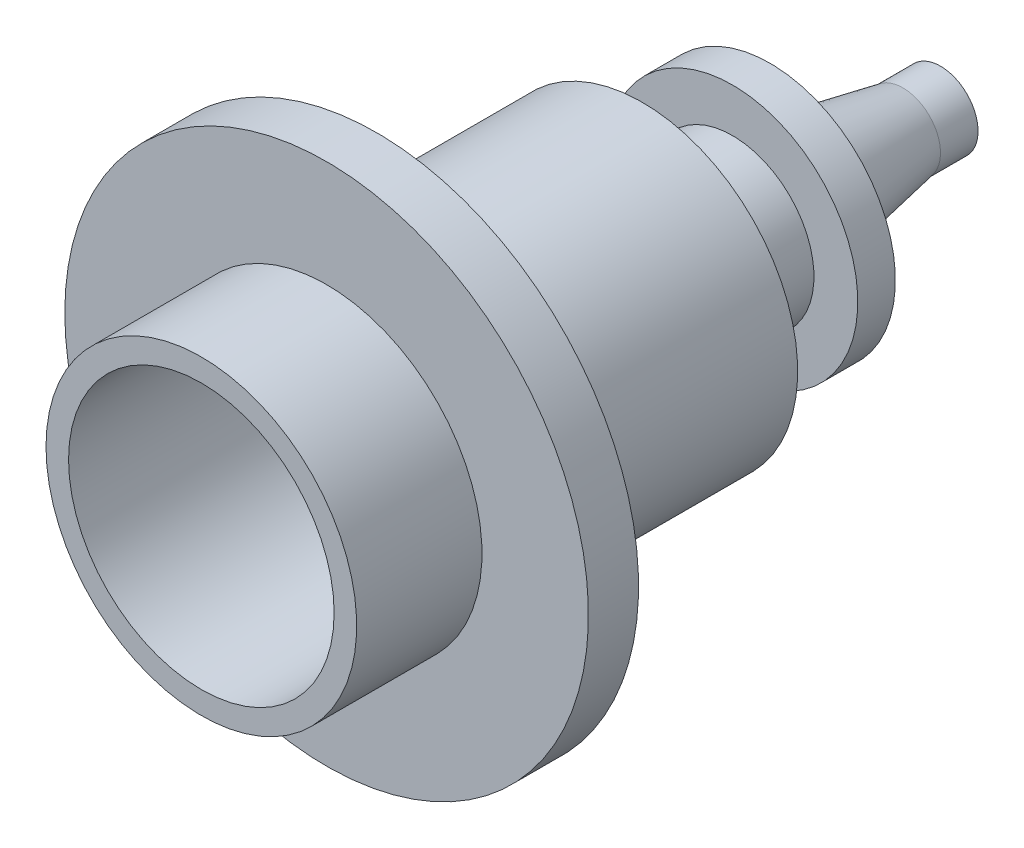
ISO-10303-21;
HEADER;
FILE_DESCRIPTION(('STEP AP214'),'2;1');
FILE_NAME('part.step','',(''),(''),'','','');
FILE_SCHEMA(('AUTOMOTIVE_DESIGN { 1 0 10303 214 1 1 1 1 }'));
ENDSEC;
DATA;
#1=APPLICATION_CONTEXT('core data for automotive mechanical design processes');
#2=APPLICATION_PROTOCOL_DEFINITION('international standard','automotive_design',2000,#1);
#3=PRODUCT_CONTEXT('',#1,'mechanical');
#4=PRODUCT('Part','Part','',(#3));
#5=PRODUCT_RELATED_PRODUCT_CATEGORY('part','',(#4));
#6=PRODUCT_DEFINITION_FORMATION('','',#4);
#7=PRODUCT_DEFINITION_CONTEXT('part definition',#1,'design');
#8=PRODUCT_DEFINITION('design','',#6,#7);
#9=PRODUCT_DEFINITION_SHAPE('','',#8);
#10=(LENGTH_UNIT() NAMED_UNIT(*) SI_UNIT(.MILLI.,.METRE.));
#11=(NAMED_UNIT(*) PLANE_ANGLE_UNIT() SI_UNIT($,.RADIAN.));
#12=(NAMED_UNIT(*) SI_UNIT($,.STERADIAN.) SOLID_ANGLE_UNIT());
#13=UNCERTAINTY_MEASURE_WITH_UNIT(LENGTH_MEASURE(1.E-05),#10,'distance_accuracy_value','');
#14=(GEOMETRIC_REPRESENTATION_CONTEXT(3) GLOBAL_UNCERTAINTY_ASSIGNED_CONTEXT((#13)) GLOBAL_UNIT_ASSIGNED_CONTEXT((#10,
#11,#12)) REPRESENTATION_CONTEXT('',''));
#15=CARTESIAN_POINT('',(0.,0.,0.));
#16=DIRECTION('',(0.,0.,1.));
#17=DIRECTION('',(1.,0.,0.));
#18=AXIS2_PLACEMENT_3D('',#15,#16,#17);
#19=CARTESIAN_POINT('',(2.5,0.,3.4));
#20=DIRECTION('',(0.,0.,1.));
#21=DIRECTION('',(1.,0.,0.));
#22=AXIS2_PLACEMENT_3D('',#19,#20,#21);
#23=PLANE('',#22);
#24=CARTESIAN_POINT('',(0.,0.,3.4));
#25=DIRECTION('',(0.,0.,-1.));
#26=DIRECTION('',(-1.,0.,0.));
#27=AXIS2_PLACEMENT_3D('',#24,#25,#26);
#28=CIRCLE('',#27,0.25);
#29=CARTESIAN_POINT('',(-0.25,0.,3.4));
#30=VERTEX_POINT('',#29);
#31=EDGE_CURVE('E63',#30,#30,#28,.T.);
#32=ORIENTED_EDGE('',*,*,#31,.F.);
#33=EDGE_LOOP('',(#32));
#34=FACE_BOUND('',#33,.T.);
#35=CARTESIAN_POINT('',(0.,0.,3.4));
#36=DIRECTION('',(0.,0.,-1.));
#37=DIRECTION('',(-1.,0.,0.));
#38=AXIS2_PLACEMENT_3D('',#35,#36,#37);
#39=CIRCLE('',#38,0.5);
#40=CARTESIAN_POINT('',(-0.499999999999999,0.,3.4));
#41=VERTEX_POINT('',#40);
#42=EDGE_CURVE('E47',#41,#41,#39,.T.);
#43=ORIENTED_EDGE('',*,*,#42,.T.);
#44=EDGE_LOOP('',(#43));
#45=FACE_BOUND('',#44,.T.);
#46=ADVANCED_FACE('F32',(#34,#45),#23,.F.);
#47=CARTESIAN_POINT('',(0.,0.,0.));
#48=DIRECTION('',(0.,0.,-1.));
#49=DIRECTION('',(-1.,0.,0.));
#50=AXIS2_PLACEMENT_3D('',#47,#48,#49);
#51=CYLINDRICAL_SURFACE('',#50,2.65);
#52=CARTESIAN_POINT('',(0.,0.,14.75));
#53=DIRECTION('',(0.,0.,-1.));
#54=DIRECTION('',(-1.,0.,0.));
#55=AXIS2_PLACEMENT_3D('',#52,#53,#54);
#56=CIRCLE('',#55,2.65);
#57=CARTESIAN_POINT('',(-2.65,0.,14.75));
#58=VERTEX_POINT('',#57);
#59=EDGE_CURVE('E36',#58,#58,#56,.T.);
#60=ORIENTED_EDGE('',*,*,#59,.F.);
#61=EDGE_LOOP('',(#60));
#62=FACE_BOUND('',#61,.T.);
#63=CARTESIAN_POINT('',(0.,0.,6.60505517197854));
#64=DIRECTION('',(0.,0.,-1.));
#65=DIRECTION('',(-1.,0.,0.));
#66=AXIS2_PLACEMENT_3D('',#63,#64,#65);
#67=CIRCLE('',#66,2.65);
#68=CARTESIAN_POINT('',(2.65,0.,6.60505517197854));
#69=VERTEX_POINT('',#68);
#70=EDGE_CURVE('E57',#69,#69,#67,.T.);
#71=ORIENTED_EDGE('',*,*,#70,.T.);
#72=EDGE_LOOP('',(#71));
#73=FACE_BOUND('',#72,.T.);
#74=ADVANCED_FACE('F34',(#62,#73),#51,.F.);
#75=CARTESIAN_POINT('',(2.65,0.,14.75));
#76=DIRECTION('',(0.,0.,-1.));
#77=DIRECTION('',(-1.,0.,0.));
#78=AXIS2_PLACEMENT_3D('',#75,#76,#77);
#79=PLANE('',#78);
#80=CARTESIAN_POINT('',(0.,0.,14.75));
#81=DIRECTION('',(0.,0.,-1.));
#82=DIRECTION('',(-1.,0.,0.));
#83=AXIS2_PLACEMENT_3D('',#80,#81,#82);
#84=CIRCLE('',#83,3.1);
#85=CARTESIAN_POINT('',(-3.1,0.,14.75));
#86=VERTEX_POINT('',#85);
#87=EDGE_CURVE('E44',#86,#86,#84,.T.);
#88=ORIENTED_EDGE('',*,*,#87,.F.);
#89=EDGE_LOOP('',(#88));
#90=FACE_BOUND('',#89,.T.);
#91=ORIENTED_EDGE('',*,*,#59,.T.);
#92=EDGE_LOOP('',(#91));
#93=FACE_BOUND('',#92,.T.);
#94=ADVANCED_FACE('F97',(#90,#93),#79,.F.);
#95=CARTESIAN_POINT('',(0.,0.,0.));
#96=DIRECTION('',(0.,0.,-1.));
#97=DIRECTION('',(-1.,0.,0.));
#98=AXIS2_PLACEMENT_3D('',#95,#96,#97);
#99=CYLINDRICAL_SURFACE('',#98,3.1);
#100=CARTESIAN_POINT('',(0.,0.,12.25));
#101=DIRECTION('',(0.,0.,-1.));
#102=DIRECTION('',(-1.,0.,0.));
#103=AXIS2_PLACEMENT_3D('',#100,#101,#102);
#104=CIRCLE('',#103,3.1);
#105=CARTESIAN_POINT('',(-3.1,0.,12.25));
#106=VERTEX_POINT('',#105);
#107=EDGE_CURVE('E90',#106,#106,#104,.T.);
#108=ORIENTED_EDGE('',*,*,#107,.F.);
#109=EDGE_LOOP('',(#108));
#110=FACE_BOUND('',#109,.T.);
#111=ORIENTED_EDGE('',*,*,#87,.T.);
#112=EDGE_LOOP('',(#111));
#113=FACE_BOUND('',#112,.T.);
#114=ADVANCED_FACE('F95',(#110,#113),#99,.T.);
#115=CARTESIAN_POINT('',(3.1,0.,12.25));
#116=DIRECTION('',(0.,0.,-1.));
#117=DIRECTION('',(-1.,0.,0.));
#118=AXIS2_PLACEMENT_3D('',#115,#116,#117);
#119=PLANE('',#118);
#120=CARTESIAN_POINT('',(0.,0.,12.25));
#121=DIRECTION('',(0.,0.,-1.));
#122=DIRECTION('',(-1.,0.,0.));
#123=AXIS2_PLACEMENT_3D('',#120,#121,#122);
#124=CIRCLE('',#123,5.225);
#125=CARTESIAN_POINT('',(-5.225,0.,12.25));
#126=VERTEX_POINT('',#125);
#127=EDGE_CURVE('E87',#126,#126,#124,.T.);
#128=ORIENTED_EDGE('',*,*,#127,.F.);
#129=EDGE_LOOP('',(#128));
#130=FACE_BOUND('',#129,.T.);
#131=ORIENTED_EDGE('',*,*,#107,.T.);
#132=EDGE_LOOP('',(#131));
#133=FACE_BOUND('',#132,.T.);
#134=ADVANCED_FACE('F178',(#130,#133),#119,.F.);
#135=CARTESIAN_POINT('',(0.,0.,0.));
#136=DIRECTION('',(0.,0.,-1.));
#137=DIRECTION('',(-1.,0.,0.));
#138=AXIS2_PLACEMENT_3D('',#135,#136,#137);
#139=CYLINDRICAL_SURFACE('',#138,5.225);
#140=CARTESIAN_POINT('',(0.,0.,11.25));
#141=DIRECTION('',(0.,0.,-1.));
#142=DIRECTION('',(-1.,0.,0.));
#143=AXIS2_PLACEMENT_3D('',#140,#141,#142);
#144=CIRCLE('',#143,5.225);
#145=CARTESIAN_POINT('',(-5.225,0.,11.25));
#146=VERTEX_POINT('',#145);
#147=EDGE_CURVE('E84',#146,#146,#144,.T.);
#148=ORIENTED_EDGE('',*,*,#147,.F.);
#149=EDGE_LOOP('',(#148));
#150=FACE_BOUND('',#149,.T.);
#151=ORIENTED_EDGE('',*,*,#127,.T.);
#152=EDGE_LOOP('',(#151));
#153=FACE_BOUND('',#152,.T.);
#154=ADVANCED_FACE('F174',(#150,#153),#139,.T.);
#155=CARTESIAN_POINT('',(5.225,0.,11.25));
#156=DIRECTION('',(0.,0.,1.));
#157=DIRECTION('',(1.,0.,0.));
#158=AXIS2_PLACEMENT_3D('',#155,#156,#157);
#159=PLANE('',#158);
#160=CARTESIAN_POINT('',(0.,0.,11.25));
#161=DIRECTION('',(0.,0.,-1.));
#162=DIRECTION('',(-1.,0.,0.));
#163=AXIS2_PLACEMENT_3D('',#160,#161,#162);
#164=CIRCLE('',#163,3.1);
#165=CARTESIAN_POINT('',(-3.1,0.,11.25));
#166=VERTEX_POINT('',#165);
#167=EDGE_CURVE('E81',#166,#166,#164,.T.);
#168=ORIENTED_EDGE('',*,*,#167,.F.);
#169=EDGE_LOOP('',(#168));
#170=FACE_BOUND('',#169,.T.);
#171=ORIENTED_EDGE('',*,*,#147,.T.);
#172=EDGE_LOOP('',(#171));
#173=FACE_BOUND('',#172,.T.);
#174=ADVANCED_FACE('F170',(#170,#173),#159,.F.);
#175=CARTESIAN_POINT('',(0.,0.,0.));
#176=DIRECTION('',(0.,0.,-1.));
#177=DIRECTION('',(-1.,0.,0.));
#178=AXIS2_PLACEMENT_3D('',#175,#176,#177);
#179=CYLINDRICAL_SURFACE('',#178,3.1);
#180=CARTESIAN_POINT('',(0.,0.,5.95));
#181=DIRECTION('',(0.,0.,-1.));
#182=DIRECTION('',(-1.,0.,0.));
#183=AXIS2_PLACEMENT_3D('',#180,#181,#182);
#184=CIRCLE('',#183,3.1);
#185=CARTESIAN_POINT('',(-3.1,0.,5.95));
#186=VERTEX_POINT('',#185);
#187=EDGE_CURVE('E78',#186,#186,#184,.T.);
#188=ORIENTED_EDGE('',*,*,#187,.F.);
#189=EDGE_LOOP('',(#188));
#190=FACE_BOUND('',#189,.T.);
#191=ORIENTED_EDGE('',*,*,#167,.T.);
#192=EDGE_LOOP('',(#191));
#193=FACE_BOUND('',#192,.T.);
#194=ADVANCED_FACE('F166',(#190,#193),#179,.T.);
#195=CARTESIAN_POINT('',(0.,0.,5.95));
#196=DIRECTION('',(0.,0.,1.));
#197=DIRECTION('',(1.,0.,0.));
#198=AXIS2_PLACEMENT_3D('',#195,#196,#197);
#199=CONICAL_SURFACE('',#198,3.1,1.30597899688911);
#200=CARTESIAN_POINT('',(0.,0.,5.55));
#201=DIRECTION('',(0.,0.,-1.));
#202=DIRECTION('',(-1.,0.,0.));
#203=AXIS2_PLACEMENT_3D('',#200,#201,#202);
#204=CIRCLE('',#203,1.625);
#205=CARTESIAN_POINT('',(-1.625,0.,5.55));
#206=VERTEX_POINT('',#205);
#207=EDGE_CURVE('E75',#206,#206,#204,.T.);
#208=ORIENTED_EDGE('',*,*,#207,.F.);
#209=EDGE_LOOP('',(#208));
#210=FACE_BOUND('',#209,.T.);
#211=ORIENTED_EDGE('',*,*,#187,.T.);
#212=EDGE_LOOP('',(#211));
#213=FACE_BOUND('',#212,.T.);
#214=ADVANCED_FACE('F162',(#210,#213),#199,.T.);
#215=CARTESIAN_POINT('',(0.,0.,0.));
#216=DIRECTION('',(0.,0.,-1.));
#217=DIRECTION('',(-1.,0.,0.));
#218=AXIS2_PLACEMENT_3D('',#215,#216,#217);
#219=CYLINDRICAL_SURFACE('',#218,1.625);
#220=CARTESIAN_POINT('',(0.,0.,4.15));
#221=DIRECTION('',(0.,0.,-1.));
#222=DIRECTION('',(-1.,0.,0.));
#223=AXIS2_PLACEMENT_3D('',#220,#221,#222);
#224=CIRCLE('',#223,1.625);
#225=CARTESIAN_POINT('',(-1.625,0.,4.15));
#226=VERTEX_POINT('',#225);
#227=EDGE_CURVE('E72',#226,#226,#224,.T.);
#228=ORIENTED_EDGE('',*,*,#227,.F.);
#229=EDGE_LOOP('',(#228));
#230=FACE_BOUND('',#229,.T.);
#231=ORIENTED_EDGE('',*,*,#207,.T.);
#232=EDGE_LOOP('',(#231));
#233=FACE_BOUND('',#232,.T.);
#234=ADVANCED_FACE('F158',(#230,#233),#219,.T.);
#235=CARTESIAN_POINT('',(1.625,0.,4.15));
#236=DIRECTION('',(0.,0.,-1.));
#237=DIRECTION('',(-1.,0.,0.));
#238=AXIS2_PLACEMENT_3D('',#235,#236,#237);
#239=PLANE('',#238);
#240=CARTESIAN_POINT('',(0.,0.,4.15));
#241=DIRECTION('',(0.,0.,-1.));
#242=DIRECTION('',(-1.,0.,0.));
#243=AXIS2_PLACEMENT_3D('',#240,#241,#242);
#244=CIRCLE('',#243,2.5);
#245=CARTESIAN_POINT('',(-2.5,0.,4.15));
#246=VERTEX_POINT('',#245);
#247=EDGE_CURVE('E69',#246,#246,#244,.T.);
#248=ORIENTED_EDGE('',*,*,#247,.F.);
#249=EDGE_LOOP('',(#248));
#250=FACE_BOUND('',#249,.T.);
#251=ORIENTED_EDGE('',*,*,#227,.T.);
#252=EDGE_LOOP('',(#251));
#253=FACE_BOUND('',#252,.T.);
#254=ADVANCED_FACE('F154',(#250,#253),#239,.F.);
#255=CARTESIAN_POINT('',(0.,0.,0.));
#256=DIRECTION('',(0.,0.,-1.));
#257=DIRECTION('',(-1.,0.,0.));
#258=AXIS2_PLACEMENT_3D('',#255,#256,#257);
#259=CYLINDRICAL_SURFACE('',#258,2.5);
#260=CARTESIAN_POINT('',(0.,0.,3.4));
#261=DIRECTION('',(0.,0.,-1.));
#262=DIRECTION('',(-1.,0.,0.));
#263=AXIS2_PLACEMENT_3D('',#260,#261,#262);
#264=CIRCLE('',#263,2.5);
#265=CARTESIAN_POINT('',(-2.5,0.,3.4));
#266=VERTEX_POINT('',#265);
#267=EDGE_CURVE('E66',#266,#266,#264,.T.);
#268=ORIENTED_EDGE('',*,*,#267,.F.);
#269=EDGE_LOOP('',(#268));
#270=FACE_BOUND('',#269,.T.);
#271=ORIENTED_EDGE('',*,*,#247,.T.);
#272=EDGE_LOOP('',(#271));
#273=FACE_BOUND('',#272,.T.);
#274=ADVANCED_FACE('F150',(#270,#273),#259,.T.);
#275=CARTESIAN_POINT('',(0.,0.,3.4));
#276=DIRECTION('',(0.,0.,-1.));
#277=DIRECTION('',(-1.,0.,0.));
#278=AXIS2_PLACEMENT_3D('',#275,#276,#277);
#279=CIRCLE('',#278,1.25);
#280=CARTESIAN_POINT('',(-1.25,0.,3.4));
#281=VERTEX_POINT('',#280);
#282=EDGE_CURVE('E10',#281,#281,#279,.T.);
#283=ORIENTED_EDGE('',*,*,#282,.F.);
#284=EDGE_LOOP('',(#283));
#285=FACE_BOUND('',#284,.T.);
#286=ORIENTED_EDGE('',*,*,#267,.T.);
#287=EDGE_LOOP('',(#286));
#288=FACE_BOUND('',#287,.T.);
#289=ADVANCED_FACE('F116',(#285,#288),#23,.F.);
#290=CARTESIAN_POINT('',(0.,0.,0.));
#291=DIRECTION('',(0.,0.,-1.));
#292=DIRECTION('',(-1.,0.,0.));
#293=AXIS2_PLACEMENT_3D('',#290,#291,#292);
#294=CYLINDRICAL_SURFACE('',#293,0.25);
#295=CARTESIAN_POINT('',(0.,0.,5.95420771435142));
#296=DIRECTION('',(0.,0.,-1.));
#297=DIRECTION('',(-1.,0.,0.));
#298=AXIS2_PLACEMENT_3D('',#295,#296,#297);
#299=CIRCLE('',#298,0.25);
#300=CARTESIAN_POINT('',(0.249999999999999,0.,5.95420771435142));
#301=VERTEX_POINT('',#300);
#302=EDGE_CURVE('E60',#301,#301,#299,.T.);
#303=ORIENTED_EDGE('',*,*,#302,.F.);
#304=EDGE_LOOP('',(#303));
#305=FACE_BOUND('',#304,.T.);
#306=ORIENTED_EDGE('',*,*,#31,.T.);
#307=EDGE_LOOP('',(#306));
#308=FACE_BOUND('',#307,.T.);
#309=ADVANCED_FACE('F110',(#305,#308),#294,.F.);
#310=CARTESIAN_POINT('',(0.,0.,5.95420771435142));
#311=DIRECTION('',(0.,0.,1.));
#312=DIRECTION('',(1.,0.,0.));
#313=AXIS2_PLACEMENT_3D('',#310,#311,#312);
#314=CONICAL_SURFACE('',#313,0.25,1.30597899688911);
#315=CARTESIAN_POINT('',(2.65,0.,6.60505517197854));
#316=CARTESIAN_POINT('',(2.625,0.,6.59827551096159));
#317=CARTESIAN_POINT('',(2.6,0.,6.59149584994464));
#318=CARTESIAN_POINT('',(2.55,0.,6.57793652791074));
#319=CARTESIAN_POINT('',(2.525,0.,6.57115686689379));
#320=CARTESIAN_POINT('',(2.475,0.,6.55759754485989));
#321=CARTESIAN_POINT('',(2.45,0.,6.55081788384294));
#322=CARTESIAN_POINT('',(2.4,0.,6.53725856180904));
#323=CARTESIAN_POINT('',(2.375,0.,6.5304789007921));
#324=CARTESIAN_POINT('',(2.325,0.,6.5169195787582));
#325=CARTESIAN_POINT('',(2.3,0.,6.51013991774125));
#326=CARTESIAN_POINT('',(2.25,0.,6.49658059570735));
#327=CARTESIAN_POINT('',(2.225,0.,6.4898009346904));
#328=CARTESIAN_POINT('',(2.175,0.,6.4762416126565));
#329=CARTESIAN_POINT('',(2.15,0.,6.46946195163955));
#330=CARTESIAN_POINT('',(2.1,0.,6.45590262960565));
#331=CARTESIAN_POINT('',(2.075,0.,6.4491229685887));
#332=CARTESIAN_POINT('',(2.025,0.,6.43556364655481));
#333=CARTESIAN_POINT('',(2.,0.,6.42878398553786));
#334=CARTESIAN_POINT('',(1.95,0.,6.41522466350396));
#335=CARTESIAN_POINT('',(1.925,0.,6.40844500248701));
#336=CARTESIAN_POINT('',(1.875,0.,6.39488568045311));
#337=CARTESIAN_POINT('',(1.85,0.,6.38810601943616));
#338=CARTESIAN_POINT('',(1.8,0.,6.37454669740226));
#339=CARTESIAN_POINT('',(1.775,0.,6.36776703638531));
#340=CARTESIAN_POINT('',(1.725,0.,6.35420771435142));
#341=CARTESIAN_POINT('',(1.7,0.,6.34742805333447));
#342=CARTESIAN_POINT('',(1.65,0.,6.33386873130057));
#343=CARTESIAN_POINT('',(1.625,0.,6.32708907028362));
#344=CARTESIAN_POINT('',(1.575,0.,6.31352974824972));
#345=CARTESIAN_POINT('',(1.55,0.,6.30675008723277));
#346=CARTESIAN_POINT('',(1.5,0.,6.29319076519887));
#347=CARTESIAN_POINT('',(1.475,0.,6.28641110418192));
#348=CARTESIAN_POINT('',(1.425,0.,6.27285178214803));
#349=CARTESIAN_POINT('',(1.4,0.,6.26607212113108));
#350=CARTESIAN_POINT('',(1.35,0.,6.25251279909718));
#351=CARTESIAN_POINT('',(1.325,0.,6.24573313808023));
#352=CARTESIAN_POINT('',(1.275,0.,6.23217381604633));
#353=CARTESIAN_POINT('',(1.25,0.,6.22539415502938));
#354=CARTESIAN_POINT('',(1.2,0.,6.21183483299548));
#355=CARTESIAN_POINT('',(1.175,0.,6.20505517197854));
#356=CARTESIAN_POINT('',(1.125,0.,6.19149584994464));
#357=CARTESIAN_POINT('',(1.1,0.,6.18471618892769));
#358=CARTESIAN_POINT('',(1.05,0.,6.17115686689379));
#359=CARTESIAN_POINT('',(1.025,0.,6.16437720587684));
#360=CARTESIAN_POINT('',(0.974999999999999,0.,6.15081788384294));
#361=CARTESIAN_POINT('',(0.949999999999999,0.,6.14403822282599));
#362=CARTESIAN_POINT('',(0.899999999999999,0.,6.13047890079209));
#363=CARTESIAN_POINT('',(0.874999999999999,0.,6.12369923977514));
#364=CARTESIAN_POINT('',(0.824999999999999,0.,6.11013991774125));
#365=CARTESIAN_POINT('',(0.799999999999999,0.,6.1033602567243));
#366=CARTESIAN_POINT('',(0.749999999999999,0.,6.0898009346904));
#367=CARTESIAN_POINT('',(0.724999999999999,0.,6.08302127367345));
#368=CARTESIAN_POINT('',(0.674999999999999,0.,6.06946195163955));
#369=CARTESIAN_POINT('',(0.649999999999999,0.,6.0626822906226));
#370=CARTESIAN_POINT('',(0.599999999999999,0.,6.0491229685887));
#371=CARTESIAN_POINT('',(0.574999999999999,0.,6.04234330757176));
#372=CARTESIAN_POINT('',(0.524999999999999,0.,6.02878398553786));
#373=CARTESIAN_POINT('',(0.499999999999999,0.,6.02200432452091));
#374=CARTESIAN_POINT('',(0.449999999999999,0.,6.00844500248701));
#375=CARTESIAN_POINT('',(0.424999999999999,0.,6.00166534147006));
#376=CARTESIAN_POINT('',(0.374999999999999,0.,5.98810601943616));
#377=CARTESIAN_POINT('',(0.349999999999999,0.,5.98132635841921));
#378=CARTESIAN_POINT('',(0.299999999999999,0.,5.96776703638531));
#379=CARTESIAN_POINT('',(0.274999999999999,0.,5.96098737536837));
#380=CARTESIAN_POINT('',(0.249999999999999,0.,5.95420771435142));
#381=B_SPLINE_CURVE_WITH_KNOTS('',3,(#315,#316,#317,#318,#319,#320,#321,#322,#323,#324,#325,
#326,#327,#328,#329,#330,#331,#332,#333,#334,#335,#336,#337,#338,#339,#340,#341,#342,#343,#344,
#345,#346,#347,#348,#349,#350,#351,#352,#353,#354,#355,#356,#357,#358,#359,#360,#361,#362,#363,
#364,#365,#366,#367,#368,#369,#370,#371,#372,#373,#374,#375,#376,#377,#378,#379,#380),
.UNSPECIFIED.,.F.,.F.,(4,2,2,2,2,2,2,2,2,2,2,2,2,2,2,2,2,2,2,2,2,2,2,2,2,2,2,2,2,2,2,2,4),(0.,
0.0777089070283618,0.155417814056725,0.233126721085087,0.310835628113449,0.388544535141811,
0.466253442170174,0.543962349198536,0.621671256226898,0.69938016325526,0.777089070283623,
0.854797977311986,0.932506884340348,1.01021579136871,1.08792469839707,1.16563360542544,
1.2433425124538,1.32105141948216,1.39876032651052,1.47646923353888,1.55417814056725,
1.63188704759561,1.70959595462397,1.78730486165233,1.8650137686807,1.94272267570906,
2.02043158273742,2.09814048976578,2.17584939679415,2.25355830382251,2.33126721085087,
2.40897611787923,2.48668502490759),.UNSPECIFIED.);
#382=EDGE_CURVE('BSEAM106',#69,#301,#381,.T.);
#383=ORIENTED_EDGE('',*,*,#70,.F.);
#384=ORIENTED_EDGE('',*,*,#302,.T.);
#385=ORIENTED_EDGE('',*,*,#382,.T.);
#386=ORIENTED_EDGE('',*,*,#382,.F.);
#387=EDGE_LOOP('',(#383,#385,#384,#386));
#388=FACE_BOUND('',#387,.T.);
#389=ADVANCED_FACE('F106',(#388),#314,.F.);
#390=CARTESIAN_POINT('',(0.,0.,0.));
#391=DIRECTION('',(0.,0.,-1.));
#392=DIRECTION('',(-1.,0.,0.));
#393=AXIS2_PLACEMENT_3D('',#390,#391,#392);
#394=CYLINDRICAL_SURFACE('',#393,0.5);
#395=ORIENTED_EDGE('',*,*,#42,.F.);
#396=EDGE_LOOP('',(#395));
#397=FACE_BOUND('',#396,.T.);
#398=CARTESIAN_POINT('',(0.,0.,0.));
#399=DIRECTION('',(0.,0.,-1.));
#400=DIRECTION('',(-1.,0.,0.));
#401=AXIS2_PLACEMENT_3D('',#398,#399,#400);
#402=CIRCLE('',#401,0.5);
#403=CARTESIAN_POINT('',(-0.5,0.,0.));
#404=VERTEX_POINT('',#403);
#405=EDGE_CURVE('E54',#404,#404,#402,.T.);
#406=ORIENTED_EDGE('',*,*,#405,.T.);
#407=EDGE_LOOP('',(#406));
#408=FACE_BOUND('',#407,.T.);
#409=ADVANCED_FACE('F109',(#397,#408),#394,.F.);
#410=CARTESIAN_POINT('',(0.5,0.,0.));
#411=DIRECTION('',(0.,0.,1.));
#412=DIRECTION('',(1.,0.,0.));
#413=AXIS2_PLACEMENT_3D('',#410,#411,#412);
#414=PLANE('',#413);
#415=ORIENTED_EDGE('',*,*,#405,.F.);
#416=EDGE_LOOP('',(#415));
#417=FACE_BOUND('',#416,.T.);
#418=CARTESIAN_POINT('',(0.,0.,0.));
#419=DIRECTION('',(0.,0.,-1.));
#420=DIRECTION('',(-1.,0.,0.));
#421=AXIS2_PLACEMENT_3D('',#418,#419,#420);
#422=CIRCLE('',#421,0.75);
#423=CARTESIAN_POINT('',(-0.75,0.,0.));
#424=VERTEX_POINT('',#423);
#425=EDGE_CURVE('E51',#424,#424,#422,.T.);
#426=ORIENTED_EDGE('',*,*,#425,.T.);
#427=EDGE_LOOP('',(#426));
#428=FACE_BOUND('',#427,.T.);
#429=ADVANCED_FACE('F128',(#417,#428),#414,.F.);
#430=CARTESIAN_POINT('',(0.,0.,0.));
#431=DIRECTION('',(0.,0.,-1.));
#432=DIRECTION('',(-1.,0.,0.));
#433=AXIS2_PLACEMENT_3D('',#430,#431,#432);
#434=CYLINDRICAL_SURFACE('',#433,0.75);
#435=ORIENTED_EDGE('',*,*,#425,.F.);
#436=EDGE_LOOP('',(#435));
#437=FACE_BOUND('',#436,.T.);
#438=CARTESIAN_POINT('',(0.,0.,0.75));
#439=DIRECTION('',(0.,0.,-1.));
#440=DIRECTION('',(-1.,0.,0.));
#441=AXIS2_PLACEMENT_3D('',#438,#439,#440);
#442=CIRCLE('',#441,0.75);
#443=CARTESIAN_POINT('',(-0.75,0.,0.75));
#444=VERTEX_POINT('',#443);
#445=EDGE_CURVE('E48',#444,#444,#442,.T.);
#446=ORIENTED_EDGE('',*,*,#445,.T.);
#447=EDGE_LOOP('',(#446));
#448=FACE_BOUND('',#447,.T.);
#449=ADVANCED_FACE('F134',(#437,#448),#434,.T.);
#450=CARTESIAN_POINT('',(0.,0.,3.4));
#451=DIRECTION('',(0.,0.,1.));
#452=DIRECTION('',(1.,0.,0.));
#453=AXIS2_PLACEMENT_3D('',#450,#451,#452);
#454=CONICAL_SURFACE('',#453,1.25,0.186486901667216);
#455=ORIENTED_EDGE('',*,*,#445,.F.);
#456=EDGE_LOOP('',(#455));
#457=FACE_BOUND('',#456,.T.);
#458=ORIENTED_EDGE('',*,*,#282,.T.);
#459=EDGE_LOOP('',(#458));
#460=FACE_BOUND('',#459,.T.);
#461=ADVANCED_FACE('F140',(#457,#460),#454,.T.);
#462=CLOSED_SHELL('',(#46,#74,#94,#114,#134,#154,#174,#194,#214,#234,#254,#274,#289,#309,#389,
#409,#429,#449,#461));
#463=MANIFOLD_SOLID_BREP('B2',#462);
#464=ADVANCED_BREP_SHAPE_REPRESENTATION('',(#18,#463),#14);
#465=SHAPE_DEFINITION_REPRESENTATION(#9,#464);
ENDSEC;
END-ISO-10303-21;
